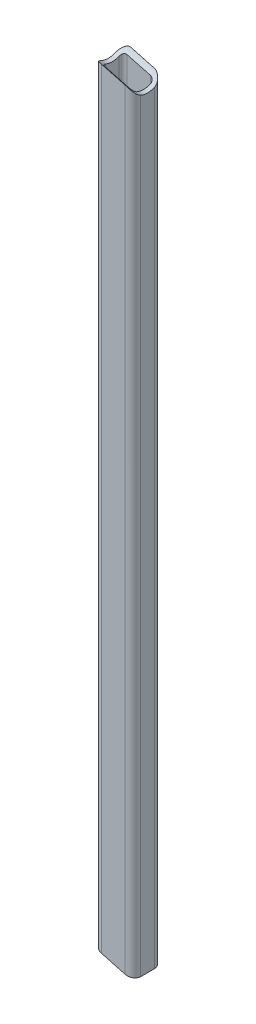
ISO-10303-21;
HEADER;
FILE_DESCRIPTION(('STEP AP214'),'2;1');
FILE_NAME('part.step','',(''),(''),'','','');
FILE_SCHEMA(('AUTOMOTIVE_DESIGN { 1 0 10303 214 1 1 1 1 }'));
ENDSEC;
DATA;
#1=APPLICATION_CONTEXT('core data for automotive mechanical design processes');
#2=APPLICATION_PROTOCOL_DEFINITION('international standard','automotive_design',2000,#1);
#3=PRODUCT_CONTEXT('',#1,'mechanical');
#4=PRODUCT('Part','Part','',(#3));
#5=PRODUCT_RELATED_PRODUCT_CATEGORY('part','',(#4));
#6=PRODUCT_DEFINITION_FORMATION('','',#4);
#7=PRODUCT_DEFINITION_CONTEXT('part definition',#1,'design');
#8=PRODUCT_DEFINITION('design','',#6,#7);
#9=PRODUCT_DEFINITION_SHAPE('','',#8);
#10=(LENGTH_UNIT() NAMED_UNIT(*) SI_UNIT(.MILLI.,.METRE.));
#11=(NAMED_UNIT(*) PLANE_ANGLE_UNIT() SI_UNIT($,.RADIAN.));
#12=(NAMED_UNIT(*) SI_UNIT($,.STERADIAN.) SOLID_ANGLE_UNIT());
#13=UNCERTAINTY_MEASURE_WITH_UNIT(LENGTH_MEASURE(1.E-05),#10,'distance_accuracy_value','');
#14=(GEOMETRIC_REPRESENTATION_CONTEXT(3) GLOBAL_UNCERTAINTY_ASSIGNED_CONTEXT((#13)) GLOBAL_UNIT_ASSIGNED_CONTEXT((#10,
#11,#12)) REPRESENTATION_CONTEXT('',''));
#15=CARTESIAN_POINT('',(0.,0.,0.));
#16=DIRECTION('',(0.,0.,1.));
#17=DIRECTION('',(1.,0.,0.));
#18=AXIS2_PLACEMENT_3D('',#15,#16,#17);
#19=CARTESIAN_POINT('',(-6.00000000000031,224.,-3.5));
#20=DIRECTION('',(0.,-0.999999999999998,0.));
#21=DIRECTION('',(0.,0.,-0.999999999999996));
#22=AXIS2_PLACEMENT_3D('',#19,#20,#21);
#23=CYLINDRICAL_SURFACE('',#22,4.);
#24=DIRECTION('',(0.,-0.999999999999998,0.));
#25=VECTOR('',#24,1.);
#26=CARTESIAN_POINT('',(-6.00000000000034,224.,-7.50000000000001));
#27=LINE('',#26,#25);
#28=CARTESIAN_POINT('',(-6.00000000000001,197.928203230275,-7.50000000000001));
#29=VERTEX_POINT('',#28);
#30=CARTESIAN_POINT('',(-6.00000000000017,-195.712812921102,-7.50000000000051));
#31=VERTEX_POINT('',#30);
#32=EDGE_CURVE('E324',#29,#31,#27,.T.);
#33=ORIENTED_EDGE('',*,*,#32,.T.);
#34=CARTESIAN_POINT('',(-5.99999999999973,-195.712812921102,-3.5000000000005));
#35=DIRECTION('',(0.258819045102521,0.965925826289067,0.));
#36=DIRECTION('',(0.965925826289067,-0.258819045102521,0.));
#37=AXIS2_PLACEMENT_3D('',#34,#35,#36);
#38=ELLIPSE('',#37,4.14110472164033,4.);
#39=CARTESIAN_POINT('',(-10.,-194.641016151378,-3.5000000000005));
#40=VERTEX_POINT('',#39);
#41=EDGE_CURVE('E502',#31,#40,#38,.T.);
#42=ORIENTED_EDGE('',*,*,#41,.T.);
#43=DIRECTION('',(0.,-0.999999999999998,0.));
#44=VECTOR('',#43,1.);
#45=CARTESIAN_POINT('',(-9.99999999999943,224.,-3.50000000000003));
#46=LINE('',#45,#44);
#47=CARTESIAN_POINT('',(-9.99999999999995,195.592324290019,-3.5));
#48=VERTEX_POINT('',#47);
#49=EDGE_CURVE('E321',#48,#40,#46,.T.);
#50=ORIENTED_EDGE('',*,*,#49,.F.);
#51=CARTESIAN_POINT('',(-5.99999999999928,197.954150165107,-7.50000000000001));
#52=CARTESIAN_POINT('',(-6.07199833976851,197.973492597121,-7.50002045898121));
#53=CARTESIAN_POINT('',(-6.14480047192218,197.989917015443,-7.49805654257957));
#54=CARTESIAN_POINT('',(-6.29125957351694,198.016687268511,-7.49005034652214));
#55=CARTESIAN_POINT('',(-6.3649161889391,198.027035534957,-7.48400970047258));
#56=CARTESIAN_POINT('',(-6.51138955973332,198.041329138648,-7.46785103020337));
#57=CARTESIAN_POINT('',(-6.58420414594102,198.04535947166,-7.45778945778067));
#58=CARTESIAN_POINT('',(-6.72922172049236,198.047421316556,-7.43365606834011));
#59=CARTESIAN_POINT('',(-6.8014247526313,198.045453261708,-7.41958454103117));
#60=CARTESIAN_POINT('',(-7.01593391728178,198.031051071808,-7.37159408672233));
#61=CARTESIAN_POINT('',(-7.15645001689288,198.010146292054,-7.3318647936688));
#62=CARTESIAN_POINT('',(-7.42911278218468,197.950371602743,-7.23879343922776));
#63=CARTESIAN_POINT('',(-7.56122804840271,197.911438338096,-7.18540367117243));
#64=CARTESIAN_POINT('',(-7.78111171289332,197.83295652889,-7.08303395896396));
#65=CARTESIAN_POINT('',(-7.87124843843999,197.796391540956,-7.03673200722882));
#66=CARTESIAN_POINT('',(-8.04606116759256,197.718019922535,-6.93855905867673));
#67=CARTESIAN_POINT('',(-8.1307346419815,197.67621089031,-6.88668551167908));
#68=CARTESIAN_POINT('',(-8.37684957860919,197.544868784455,-6.72326455201768));
#69=CARTESIAN_POINT('',(-8.53017078793913,197.449504017382,-6.60401912453665));
#70=CARTESIAN_POINT('',(-8.76821216131316,197.283925809094,-6.39023908556858));
#71=CARTESIAN_POINT('',(-8.85888648274131,197.215783156617,-6.30051501713396));
#72=CARTESIAN_POINT('',(-9.03069277241859,197.077540555344,-6.11361983488971));
#73=CARTESIAN_POINT('',(-9.11182182318818,197.007440016187,-6.01644645913547));
#74=CARTESIAN_POINT('',(-9.26434621631499,196.866554125815,-5.8151662255159));
#75=CARTESIAN_POINT('',(-9.33573867614176,196.795768578416,-5.71105732789957));
#76=CARTESIAN_POINT('',(-9.46846686126131,196.65451628929,-5.49641067634517));
#77=CARTESIAN_POINT('',(-9.5298029241981,196.584049536936,-5.38587313841788));
#78=CARTESIAN_POINT('',(-9.64236055092744,196.443791402045,-5.15814601859667));
#79=CARTESIAN_POINT('',(-9.69351187616677,196.374007666022,-5.04091696344782));
#80=CARTESIAN_POINT('',(-9.78461752030885,196.236345544497,-4.80119153894056));
#81=CARTESIAN_POINT('',(-9.82457789038078,196.16846614722,-4.67869805765408));
#82=CARTESIAN_POINT('',(-9.89265241982735,196.035340933163,-4.42946617292149));
#83=CARTESIAN_POINT('',(-9.92079431029,195.97008927987,-4.30273846832222));
#84=CARTESIAN_POINT('',(-9.96473371776024,195.842588017077,-4.04575986229331));
#85=CARTESIAN_POINT('',(-9.98054063520118,195.780336155463,-3.91551172225358));
#86=CARTESIAN_POINT('',(-9.99325304313632,195.698092228372,-3.73698561108989));
#87=CARTESIAN_POINT('',(-9.99577860897964,195.676616472675,-3.68974176439815));
#88=CARTESIAN_POINT('',(-9.99915120755163,195.634126947356,-3.5950339985138));
#89=CARTESIAN_POINT('',(-9.99999961947208,195.613112812203,-3.54757029234616));
#90=CARTESIAN_POINT('',(-9.99999999999995,195.592324290019,-3.5));
#91=B_SPLINE_CURVE_WITH_KNOTS('',3,(#51,#52,#53,#54,#55,#56,#57,#58,#59,#60,#61,#62,#63,#64,#65,
#66,#67,#68,#69,#70,#71,#72,#73,#74,#75,#76,#77,#78,#79,#80,#81,#82,#83,#84,#85,#86,#87,#88,#89,
#90),.UNSPECIFIED.,.F.,.F.,(4,2,2,2,2,2,2,2,2,2,2,2,2,2,2,2,2,2,2,4),(0.,0.223595701750445,
0.447101858533675,0.667574540309132,0.888031297538187,1.32802158562176,1.76956994559069,
2.09232548930576,2.41522939646784,3.06178470656212,3.49522503794044,3.928797506606,
4.36249805761301,4.79618404412007,5.23276454364592,5.66910851771006,6.10442284748007,
6.53940510107657,6.69525440572561,6.85097549576017),.UNSPECIFIED.);
#92=CARTESIAN_POINT('',(-6.36497043008316,198.025996762277,-7.48331477354791));
#93=VERTEX_POINT('',#92);
#94=EDGE_CURVE('E396',#93,#48,#91,.T.);
#95=ORIENTED_EDGE('',*,*,#94,.F.);
#96=CARTESIAN_POINT('',(-6.00000000000001,197.928203230275,-3.5));
#97=DIRECTION('',(0.258819045102521,0.965925826289067,0.));
#98=DIRECTION('',(0.965925826289067,-0.258819045102521,0.));
#99=AXIS2_PLACEMENT_3D('',#96,#97,#98);
#100=ELLIPSE('',#99,4.14110472164033,4.);
#101=EDGE_CURVE('E292',#29,#93,#100,.T.);
#102=ORIENTED_EDGE('',*,*,#101,.F.);
#103=EDGE_LOOP('',(#33,#42,#50,#95,#102));
#104=FACE_BOUND('',#103,.T.);
#105=ADVANCED_FACE('F136',(#104),#23,.T.);
#106=CARTESIAN_POINT('',(6.00000000000039,224.,-3.5));
#107=DIRECTION('',(0.,-0.999999999999998,0.));
#108=DIRECTION('',(0.,0.,-0.999999999999996));
#109=AXIS2_PLACEMENT_3D('',#106,#107,#108);
#110=CYLINDRICAL_SURFACE('',#109,4.);
#111=DIRECTION('',(0.,-0.999999999999998,0.));
#112=VECTOR('',#111,1.);
#113=CARTESIAN_POINT('',(10.,224.,-3.4999999999995));
#114=LINE('',#113,#112);
#115=CARTESIAN_POINT('',(10.,190.233340441396,-3.5));
#116=VERTEX_POINT('',#115);
#117=CARTESIAN_POINT('',(10.0000000000006,-200.000000000001,-3.5));
#118=VERTEX_POINT('',#117);
#119=EDGE_CURVE('E277',#116,#118,#114,.T.);
#120=ORIENTED_EDGE('',*,*,#119,.T.);
#121=CARTESIAN_POINT('',(5.99999999999989,-198.928203230275,-3.5));
#122=DIRECTION('',(0.258819045102521,0.965925826289067,0.));
#123=DIRECTION('',(0.965925826289067,-0.258819045102521,0.));
#124=AXIS2_PLACEMENT_3D('',#121,#122,#123);
#125=ELLIPSE('',#124,4.14110472164033,4.);
#126=CARTESIAN_POINT('',(5.99999999999989,-198.928203230275,-7.49999999999998));
#127=VERTEX_POINT('',#126);
#128=EDGE_CURVE('E286',#118,#127,#125,.T.);
#129=ORIENTED_EDGE('',*,*,#128,.T.);
#130=DIRECTION('',(0.,-0.999999999999998,0.));
#131=VECTOR('',#130,1.);
#132=CARTESIAN_POINT('',(6.00000000000039,224.,-7.50000000000001));
#133=LINE('',#132,#131);
#134=CARTESIAN_POINT('',(6.00000000000009,194.712812921102,-7.50000000000001));
#135=VERTEX_POINT('',#134);
#136=EDGE_CURVE('E327',#135,#127,#133,.T.);
#137=ORIENTED_EDGE('',*,*,#136,.F.);
#138=CARTESIAN_POINT('',(6.00000000000009,194.712812921102,-3.5));
#139=DIRECTION('',(0.258819045102521,0.965925826289067,0.));
#140=DIRECTION('',(0.965925826289067,-0.258819045102521,0.));
#141=AXIS2_PLACEMENT_3D('',#138,#139,#140);
#142=ELLIPSE('',#141,4.14110472164033,4.);
#143=CARTESIAN_POINT('',(6.36497043008322,194.6150193891,-7.48331477354788));
#144=VERTEX_POINT('',#143);
#145=EDGE_CURVE('E339',#144,#135,#142,.T.);
#146=ORIENTED_EDGE('',*,*,#145,.F.);
#147=CARTESIAN_POINT('',(10.,190.233340441396,-3.5));
#148=CARTESIAN_POINT('',(10.0000039597587,190.285497682975,-3.61941159564714));
#149=CARTESIAN_POINT('',(9.99465514727837,190.341497889154,-3.73702282390056));
#150=CARTESIAN_POINT('',(9.9742431187977,190.460102707452,-3.9677186439569));
#151=CARTESIAN_POINT('',(9.95919911188195,190.52269405584,-4.08081171805826));
#152=CARTESIAN_POINT('',(9.92057780956657,190.652946705788,-4.30089619738556));
#153=CARTESIAN_POINT('',(9.89708897308762,190.720549886486,-4.40793801081459));
#154=CARTESIAN_POINT('',(9.84242896111663,190.86053929694,-4.61687362274736));
#155=CARTESIAN_POINT('',(9.81125298798812,190.932928492979,-4.71876415823619));
#156=CARTESIAN_POINT('',(9.73151586870854,191.104218626421,-4.94725457474902));
#157=CARTESIAN_POINT('',(9.68054954960423,191.204503204068,-5.07197958564878));
#158=CARTESIAN_POINT('',(9.56839567317739,191.410213644478,-5.31221797948048));
#159=CARTESIAN_POINT('',(9.50720614765537,191.515640494472,-5.42772958228323));
#160=CARTESIAN_POINT('',(9.37539741752909,191.730811161628,-5.65023174495112));
#161=CARTESIAN_POINT('',(9.30473228545341,191.840574042118,-5.75717647271143));
#162=CARTESIAN_POINT('',(9.15502253840616,192.062669033592,-5.96209970225179));
#163=CARTESIAN_POINT('',(9.07597858730317,192.175000940475,-6.0600789132411));
#164=CARTESIAN_POINT('',(8.9076649640863,192.404249240453,-6.24991376444276));
#165=CARTESIAN_POINT('',(8.81817116116514,192.52120599516,-6.34152156690262));
#166=CARTESIAN_POINT('',(8.63099324787651,192.755363054529,-6.51566267516224));
#167=CARTESIAN_POINT('',(8.53330753111056,192.872563402543,-6.59819419377387));
#168=CARTESIAN_POINT('',(8.32964381500081,193.105678533644,-6.75410493389803));
#169=CARTESIAN_POINT('',(8.22367208920214,193.221594214898,-6.82749097255141));
#170=CARTESIAN_POINT('',(8.00286890281658,193.450378162225,-6.96488352133596));
#171=CARTESIAN_POINT('',(7.88804171603827,193.563247863277,-7.02889451332545));
#172=CARTESIAN_POINT('',(7.62563196365069,193.804690330092,-7.15823004014473));
#173=CARTESIAN_POINT('',(7.47597109743582,193.932172182084,-7.22149343606077));
#174=CARTESIAN_POINT('',(7.23972582691607,194.112729301501,-7.3039384648415));
#175=CARTESIAN_POINT('',(7.15924538972838,194.170998017666,-7.3292946404341));
#176=CARTESIAN_POINT('',(6.99397576033971,194.283020472454,-7.37548560794321));
#177=CARTESIAN_POINT('',(6.90918728749537,194.336774960913,-7.39632115167346));
#178=CARTESIAN_POINT('',(6.69513395819922,194.461758847237,-7.44126739000091));
#179=CARTESIAN_POINT('',(6.56325986304434,194.529739578734,-7.46251929741795));
#180=CARTESIAN_POINT('',(6.35792801859199,194.618812891832,-7.48455682130846));
#181=CARTESIAN_POINT('',(6.28781334136135,194.646473190418,-7.49026641545984));
#182=CARTESIAN_POINT('',(6.14542576467514,194.69666142003,-7.49799396717611));
#183=CARTESIAN_POINT('',(6.07314887646443,194.719179107415,-7.50000461196689));
#184=CARTESIAN_POINT('',(6.00000000000048,194.738759855933,-7.50000000000001));
#185=B_SPLINE_CURVE_WITH_KNOTS('',3,(#147,#148,#149,#150,#151,#152,#153,#154,#155,#156,#157,
#158,#159,#160,#161,#162,#163,#164,#165,#166,#167,#168,#169,#170,#171,#172,#173,#174,#175,#176,
#177,#178,#179,#180,#181,#182,#183,#184),.UNSPECIFIED.,.F.,.F.,(4,2,2,2,2,2,2,2,2,2,2,2,2,2,2,2,
2,2,4),(0.,0.390576619612435,0.780381759175893,1.16621731551446,1.55229428879928,
2.05542899139974,2.5586606707165,3.06442613676449,3.57015156003498,4.09001821372232,
4.60998705044375,5.12956594843268,5.64889563872234,6.26689605724757,6.57428345010519,
6.88161968296681,7.32948745767249,7.55599195818499,7.78294377586684),.UNSPECIFIED.);
#186=EDGE_CURVE('E347',#116,#144,#185,.T.);
#187=ORIENTED_EDGE('',*,*,#186,.F.);
#188=EDGE_LOOP('',(#120,#129,#137,#146,#187));
#189=FACE_BOUND('',#188,.T.);
#190=ADVANCED_FACE('F346',(#189),#110,.T.);
#191=CARTESIAN_POINT('',(6.00000000000042,224.,3.5));
#192=DIRECTION('',(0.,-0.999999999999998,0.));
#193=DIRECTION('',(0.,0.,-0.999999999999996));
#194=AXIS2_PLACEMENT_3D('',#191,#192,#193);
#195=CYLINDRICAL_SURFACE('',#194,4.);
#196=DIRECTION('',(0.,-0.999999999999998,0.));
#197=VECTOR('',#196,1.);
#198=CARTESIAN_POINT('',(6.00000000000045,224.,7.49999999999998));
#199=LINE('',#198,#197);
#200=CARTESIAN_POINT('',(6.00000000000012,194.712812921102,7.50000000000001));
#201=VERTEX_POINT('',#200);
#202=CARTESIAN_POINT('',(5.99999999999989,-198.928203230275,7.50000000000001));
#203=VERTEX_POINT('',#202);
#204=EDGE_CURVE('E276',#201,#203,#199,.T.);
#205=ORIENTED_EDGE('',*,*,#204,.T.);
#206=CARTESIAN_POINT('',(5.99999999999989,-198.928203230275,3.5));
#207=DIRECTION('',(0.258819045102521,0.965925826289067,0.));
#208=DIRECTION('',(0.965925826289067,-0.258819045102521,0.));
#209=AXIS2_PLACEMENT_3D('',#206,#207,#208);
#210=ELLIPSE('',#209,4.14110472164033,4.);
#211=CARTESIAN_POINT('',(10.0000000000002,-200.,3.5));
#212=VERTEX_POINT('',#211);
#213=EDGE_CURVE('E281',#203,#212,#210,.T.);
#214=ORIENTED_EDGE('',*,*,#213,.T.);
#215=DIRECTION('',(0.,-0.999999999999998,0.));
#216=VECTOR('',#215,1.);
#217=CARTESIAN_POINT('',(10.0000000000001,224.,3.5000000000005));
#218=LINE('',#217,#216);
#219=CARTESIAN_POINT('',(10.0000000000002,190.233340441397,3.5));
#220=VERTEX_POINT('',#219);
#221=EDGE_CURVE('E266',#220,#212,#218,.T.);
#222=ORIENTED_EDGE('',*,*,#221,.F.);
#223=CARTESIAN_POINT('',(6.00000000000073,194.738759855933,7.50000000000001));
#224=CARTESIAN_POINT('',(6.08297214714933,194.716558452236,7.50000710865694));
#225=CARTESIAN_POINT('',(6.16479948079753,194.690573445014,7.49741964667582));
#226=CARTESIAN_POINT('',(6.32556770304144,194.632113238928,7.48753747152493));
#227=CARTESIAN_POINT('',(6.4045159515217,194.599656196241,7.480255802324));
#228=CARTESIAN_POINT('',(6.63454569787186,194.495003998734,7.45234227799835));
#229=CARTESIAN_POINT('',(6.78127408649056,194.414813163013,7.4256124494345));
#230=CARTESIAN_POINT('',(7.03007803752751,194.260318902147,7.36669701618611));
#231=CARTESIAN_POINT('',(7.1346771095572,194.188882661342,7.33716832504121));
#232=CARTESIAN_POINT('',(7.33726608227173,194.039937377998,7.27134643532528));
#233=CARTESIAN_POINT('',(7.4352533628667,193.962425954011,7.2350505762846));
#234=CARTESIAN_POINT('',(7.62599854026475,193.802479494651,7.15607503013969));
#235=CARTESIAN_POINT('',(7.71870135416903,193.720006384109,7.1133407617991));
#236=CARTESIAN_POINT('',(7.89850709904157,193.552127085546,7.02219026303801));
#237=CARTESIAN_POINT('',(7.98560836316367,193.466720035969,6.973772353342));
#238=CARTESIAN_POINT('',(8.20072514445723,193.246959010643,6.84367108346048));
#239=CARTESIAN_POINT('',(8.32516112415453,193.111302343458,6.75824174886045));
#240=CARTESIAN_POINT('',(8.5626861555181,192.83838964291,6.57492088784188));
#241=CARTESIAN_POINT('',(8.67576896978568,192.701132776117,6.47702257727831));
#242=CARTESIAN_POINT('',(8.89050855051055,192.427606539852,6.26898079011316));
#243=CARTESIAN_POINT('',(8.99218990994102,192.291335662103,6.1588647301714));
#244=CARTESIAN_POINT('',(9.18392222010827,192.021546833754,5.92597931508062));
#245=CARTESIAN_POINT('',(9.27397940439014,191.888027440205,5.80321680572463));
#246=CARTESIAN_POINT('',(9.41714000543874,191.663743841642,5.58209130094009));
#247=CARTESIAN_POINT('',(9.47339094459874,191.57179884798,5.48696224253226));
#248=CARTESIAN_POINT('',(9.57887562655249,191.391114080107,5.290012236524));
#249=CARTESIAN_POINT('',(9.628107878295,191.30237498994,5.1881898736896));
#250=CARTESIAN_POINT('',(9.76375821122448,191.043003151825,4.87337554123131));
#251=CARTESIAN_POINT('',(9.83875321160795,190.878244784008,4.65009854418406));
#252=CARTESIAN_POINT('',(9.92779285296291,190.633365537877,4.27079135487001));
#253=CARTESIAN_POINT('',(9.9542055181791,190.545374255137,4.12268598476501));
#254=CARTESIAN_POINT('',(9.9812907759854,190.421743949823,3.89402688730338));
#255=CARTESIAN_POINT('',(9.98823185997928,190.381831170399,3.81650757520415));
#256=CARTESIAN_POINT('',(9.99758874900283,190.305147451478,3.65959032348482));
#257=CARTESIAN_POINT('',(10.0000009657707,190.268379025275,3.58019094466057));
#258=CARTESIAN_POINT('',(10.0000000000002,190.233340441397,3.49999999999998));
#259=B_SPLINE_CURVE_WITH_KNOTS('',3,(#223,#224,#225,#226,#227,#228,#229,#230,#231,#232,#233,
#234,#235,#236,#237,#238,#239,#240,#241,#242,#243,#244,#245,#246,#247,#248,#249,#250,#251,#252,
#253,#254,#255,#256,#257,#258),.UNSPECIFIED.,.F.,.F.,(4,2,2,2,2,2,2,2,2,2,2,2,2,2,2,2,2,4),(0.,
0.257343886331635,0.513975746035608,1.01966699430199,1.40938925022098,1.79926504732163,
2.19265426816888,2.58616001282298,3.19417410424902,3.80252042974419,4.40952822694788,
5.01620914751301,5.44714111266681,5.87816448910077,6.73579033771166,7.25741840694417,
7.51963881321162,7.78206689150552),.UNSPECIFIED.);
#260=CARTESIAN_POINT('',(6.36497043008333,194.6150193891,7.48331477354788));
#261=VERTEX_POINT('',#260);
#262=EDGE_CURVE('E413',#261,#220,#259,.T.);
#263=ORIENTED_EDGE('',*,*,#262,.F.);
#264=CARTESIAN_POINT('',(6.00000000000012,194.712812921102,3.5));
#265=DIRECTION('',(0.258819045102521,0.965925826289067,0.));
#266=DIRECTION('',(0.965925826289067,-0.258819045102521,0.));
#267=AXIS2_PLACEMENT_3D('',#264,#265,#266);
#268=ELLIPSE('',#267,4.14110472164033,4.);
#269=EDGE_CURVE('E348',#201,#261,#268,.T.);
#270=ORIENTED_EDGE('',*,*,#269,.F.);
#271=EDGE_LOOP('',(#205,#214,#222,#263,#270));
#272=FACE_BOUND('',#271,.T.);
#273=ADVANCED_FACE('F282',(#272),#195,.T.);
#274=CARTESIAN_POINT('',(-5.99999999999951,224.000000000001,3.49999999999998));
#275=DIRECTION('',(0.,-0.999999999999998,0.));
#276=DIRECTION('',(0.,0.,-0.999999999999996));
#277=AXIS2_PLACEMENT_3D('',#274,#275,#276);
#278=CYLINDRICAL_SURFACE('',#277,4.);
#279=DIRECTION('',(0.,-0.999999999999998,0.));
#280=VECTOR('',#279,1.);
#281=CARTESIAN_POINT('',(-9.99999999999937,224.,3.49999999999998));
#282=LINE('',#281,#280);
#283=CARTESIAN_POINT('',(-9.99999999999993,195.592324290019,3.49999999999998));
#284=VERTEX_POINT('',#283);
#285=CARTESIAN_POINT('',(-10.,-194.641016151378,3.4999999999995));
#286=VERTEX_POINT('',#285);
#287=EDGE_CURVE('E318',#284,#286,#282,.T.);
#288=ORIENTED_EDGE('',*,*,#287,.T.);
#289=CARTESIAN_POINT('',(-5.99999999999973,-195.712812921102,3.4999999999995));
#290=DIRECTION('',(0.258819045102521,0.965925826289067,0.));
#291=DIRECTION('',(0.965925826289067,-0.258819045102521,0.));
#292=AXIS2_PLACEMENT_3D('',#289,#290,#291);
#293=ELLIPSE('',#292,4.14110472164033,4.);
#294=CARTESIAN_POINT('',(-6.00000000000017,-195.712812921102,7.49999999999951));
#295=VERTEX_POINT('',#294);
#296=EDGE_CURVE('E495',#286,#295,#293,.T.);
#297=ORIENTED_EDGE('',*,*,#296,.T.);
#298=DIRECTION('',(0.,-0.999999999999998,0.));
#299=VECTOR('',#298,1.);
#300=CARTESIAN_POINT('',(-5.99999999999998,224.,7.49999999999998));
#301=LINE('',#300,#299);
#302=CARTESIAN_POINT('',(-5.99999999999995,197.928203230275,7.49999999999998));
#303=VERTEX_POINT('',#302);
#304=EDGE_CURVE('E332',#303,#295,#301,.T.);
#305=ORIENTED_EDGE('',*,*,#304,.F.);
#306=CARTESIAN_POINT('',(-5.99999999999995,197.928203230275,3.5));
#307=DIRECTION('',(0.258819045102521,0.965925826289067,0.));
#308=DIRECTION('',(0.965925826289067,-0.258819045102521,0.));
#309=AXIS2_PLACEMENT_3D('',#306,#307,#308);
#310=ELLIPSE('',#309,4.14110472164033,4.);
#311=CARTESIAN_POINT('',(-6.36497043008311,198.025996762277,7.48331477354791));
#312=VERTEX_POINT('',#311);
#313=EDGE_CURVE('E356',#312,#303,#310,.T.);
#314=ORIENTED_EDGE('',*,*,#313,.F.);
#315=CARTESIAN_POINT('',(-9.99999999999993,195.592324290019,3.49999999999998));
#316=CARTESIAN_POINT('',(-10.000011196747,195.647401198976,3.62609638231995));
#317=CARTESIAN_POINT('',(-9.99403895210997,195.704114545441,3.75143983148846));
#318=CARTESIAN_POINT('',(-9.97062902587805,195.820439077019,3.99960214930839));
#319=CARTESIAN_POINT('',(-9.95319814762585,195.880048523192,4.12242247142273));
#320=CARTESIAN_POINT('',(-9.9074491292813,196.001649330052,4.36425990547077));
#321=CARTESIAN_POINT('',(-9.87916820119865,196.063631904711,4.4832885268491));
#322=CARTESIAN_POINT('',(-9.81223486018251,196.189735256112,4.71723844432132));
#323=CARTESIAN_POINT('',(-9.77358107840729,196.253856314077,4.83215919605512));
#324=CARTESIAN_POINT('',(-9.68650736806057,196.383563114369,5.05697223727112));
#325=CARTESIAN_POINT('',(-9.63811056917698,196.449145066654,5.16687569354738));
#326=CARTESIAN_POINT('',(-9.53194005532002,196.581327731769,5.38141601417797));
#327=CARTESIAN_POINT('',(-9.4741659618002,196.647928485628,5.48605266569628));
#328=CARTESIAN_POINT('',(-9.34951826788167,196.781551656527,5.68975067868591));
#329=CARTESIAN_POINT('',(-9.2826312685636,196.848574553208,5.78880352116621));
#330=CARTESIAN_POINT('',(-9.14009445070405,196.982110160462,5.98074512999958));
#331=CARTESIAN_POINT('',(-9.06444559260491,197.048622926105,6.07363457020945));
#332=CARTESIAN_POINT('',(-8.91362913718892,197.172635610362,6.24264319224808));
#333=CARTESIAN_POINT('',(-8.83938626135027,197.2302998935,6.31946792181388));
#334=CARTESIAN_POINT('',(-8.68412890760772,197.343549870623,6.46765400354763));
#335=CARTESIAN_POINT('',(-8.60311369864936,197.399135339265,6.53901476429827));
#336=CARTESIAN_POINT('',(-8.43438265649652,197.507019026755,6.67577650330552));
#337=CARTESIAN_POINT('',(-8.34667720109703,197.559322116341,6.74118638024564));
#338=CARTESIAN_POINT('',(-8.16441260416273,197.659254845873,6.86563348820297));
#339=CARTESIAN_POINT('',(-8.06985694280674,197.706886830376,6.92467391772758));
#340=CARTESIAN_POINT('',(-7.84611105936458,197.808191216622,7.0514428128464));
#341=CARTESIAN_POINT('',(-7.71466740262581,197.859785744575,7.11693399051133));
#342=CARTESIAN_POINT('',(-7.44096732063083,197.947072810348,7.23439037261954));
#343=CARTESIAN_POINT('',(-7.29873396895223,197.982798220893,7.28638344447809));
#344=CARTESIAN_POINT('',(-7.02987238963871,198.028293013712,7.36725814332138));
#345=CARTESIAN_POINT('',(-6.90454530000155,198.041374179084,7.39853834560732));
#346=CARTESIAN_POINT('',(-6.65085806707449,198.049309657256,7.44880009067561));
#347=CARTESIAN_POINT('',(-6.52250158011665,198.044184927744,7.46779574502835));
#348=CARTESIAN_POINT('',(-6.32831154070029,198.021980084532,7.48706729147808));
#349=CARTESIAN_POINT('',(-6.26204436035365,198.011820417643,7.49195210286398));
#350=CARTESIAN_POINT('',(-6.13031408616948,197.986602008509,7.49842053229439));
#351=CARTESIAN_POINT('',(-6.064850640277,197.971545496883,7.50000565099181));
#352=CARTESIAN_POINT('',(-5.99999999999926,197.954150165107,7.49999999999998));
#353=B_SPLINE_CURVE_WITH_KNOTS('',3,(#315,#316,#317,#318,#319,#320,#321,#322,#323,#324,#325,
#326,#327,#328,#329,#330,#331,#332,#333,#334,#335,#336,#337,#338,#339,#340,#341,#342,#343,#344,
#345,#346,#347,#348,#349,#350,#351,#352),.UNSPECIFIED.,.F.,.F.,(4,2,2,2,2,2,2,2,2,2,2,2,2,2,2,2,
2,2,4),(0.,0.412608288265835,0.824971819311023,1.23593354595824,1.64694953138968,
2.05700104325547,2.46706911236749,2.87774675523245,3.28837942367237,3.6522869291968,
4.01623376837289,4.37962711137785,4.7428371134715,5.20835688321471,5.67290778413489,
6.06075324602136,6.44815238490859,6.64957411762557,6.85090422659688),.UNSPECIFIED.);
#354=EDGE_CURVE('E405',#284,#312,#353,.T.);
#355=ORIENTED_EDGE('',*,*,#354,.F.);
#356=EDGE_LOOP('',(#288,#297,#305,#314,#355));
#357=FACE_BOUND('',#356,.T.);
#358=ADVANCED_FACE('F138',(#357),#278,.T.);
#359=CARTESIAN_POINT('',(-6.00000000000031,224.,-3.5));
#360=DIRECTION('',(0.,-0.999999999999998,0.));
#361=DIRECTION('',(0.,0.,-0.999999999999996));
#362=AXIS2_PLACEMENT_3D('',#359,#360,#361);
#363=CYLINDRICAL_SURFACE('',#362,2.);
#364=CARTESIAN_POINT('',(-5.99999999999973,-195.712812921102,-3.5000000000005));
#365=DIRECTION('',(0.258819045102521,0.965925826289067,0.));
#366=DIRECTION('',(0.965925826289067,-0.258819045102521,0.));
#367=AXIS2_PLACEMENT_3D('',#364,#365,#366);
#368=ELLIPSE('',#367,2.07055236082017,2.);
#369=CARTESIAN_POINT('',(-6.00000000000017,-195.712812921102,-5.5000000000005));
#370=VERTEX_POINT('',#369);
#371=CARTESIAN_POINT('',(-8.00000000000001,-195.17691453624,-3.5000000000005));
#372=VERTEX_POINT('',#371);
#373=EDGE_CURVE('E152',#370,#372,#368,.T.);
#374=ORIENTED_EDGE('',*,*,#373,.F.);
#375=DIRECTION('',(0.,-0.999999999999998,0.));
#376=VECTOR('',#375,1.);
#377=CARTESIAN_POINT('',(-6.00000000000031,224.,-5.50000000000001));
#378=LINE('',#377,#376);
#379=CARTESIAN_POINT('',(-5.99999999999962,195.729376605515,-5.50000000000001));
#380=VERTEX_POINT('',#379);
#381=EDGE_CURVE('E303',#380,#370,#378,.T.);
#382=ORIENTED_EDGE('',*,*,#381,.F.);
#383=CARTESIAN_POINT('',(-5.99999999999962,195.729376605515,-5.50000000000001));
#384=CARTESIAN_POINT('',(-6.04387885250471,195.741142631754,-5.50000668106419));
#385=CARTESIAN_POINT('',(-6.08805842744288,195.751817723569,-5.4985559377919));
#386=CARTESIAN_POINT('',(-6.17672294076924,195.770875571795,-5.49267079400469));
#387=CARTESIAN_POINT('',(-6.2212079553548,195.77925773319,-5.48823562006119));
#388=CARTESIAN_POINT('',(-6.31004123639406,195.793593193347,-5.47632921250855));
#389=CARTESIAN_POINT('',(-6.35438954091342,195.79955314263,-5.46886640597068));
#390=CARTESIAN_POINT('',(-6.44271300428273,195.80903126179,-5.45090750731976));
#391=CARTESIAN_POINT('',(-6.48668821452412,195.812549773537,-5.44041184018352));
#392=CARTESIAN_POINT('',(-6.61772156133485,195.819438616841,-5.40436491692737));
#393=CARTESIAN_POINT('',(-6.70379527353737,195.819127515637,-5.37426594833111));
#394=CARTESIAN_POINT('',(-6.87052420597753,195.809364869131,-5.30289575279125));
#395=CARTESIAN_POINT('',(-6.95117945285738,195.799913368775,-5.26162458078561));
#396=CARTESIAN_POINT('',(-7.10527519555256,195.773213767687,-5.16926368360949));
#397=CARTESIAN_POINT('',(-7.17871094637671,195.755960580478,-5.11816756536712));
#398=CARTESIAN_POINT('',(-7.31710880343283,195.715209531145,-5.007673728483));
#399=CARTESIAN_POINT('',(-7.38206549386634,195.69170770667,-4.94827075371429));
#400=CARTESIAN_POINT('',(-7.51104481889191,195.636413335829,-4.81398461523992));
#401=CARTESIAN_POINT('',(-7.57371998791852,195.603926033922,-4.73809561403374));
#402=CARTESIAN_POINT('',(-7.68659973564091,195.534709545489,-4.57929846447495));
#403=CARTESIAN_POINT('',(-7.7367958561392,195.497977506483,-4.49638560616827));
#404=CARTESIAN_POINT('',(-7.83132022119591,195.415743926536,-4.31159142333223));
#405=CARTESIAN_POINT('',(-7.87344680659501,195.369776611966,-4.20879011702201));
#406=CARTESIAN_POINT('',(-7.94002481664659,195.276058930998,-3.99845227958404));
#407=CARTESIAN_POINT('',(-7.96448691878834,195.228309660112,-3.89091865073975));
#408=CARTESIAN_POINT('',(-7.98665063069169,195.159723317,-3.73549795310531));
#409=CARTESIAN_POINT('',(-7.99165900657802,195.139034573269,-3.68849180182166));
#410=CARTESIAN_POINT('',(-7.99832958513916,195.09769528379,-3.5943351068873));
#411=CARTESIAN_POINT('',(-7.99999825942398,195.077044741788,-3.54718502016047));
#412=CARTESIAN_POINT('',(-8.0000000000004,195.056425905157,-3.5));
#413=B_SPLINE_CURVE_WITH_KNOTS('',3,(#383,#384,#385,#386,#387,#388,#389,#390,#391,#392,#393,
#394,#395,#396,#397,#398,#399,#400,#401,#402,#403,#404,#405,#406,#407,#408,#409,#410,#411,#412),
.UNSPECIFIED.,.F.,.F.,(4,2,2,2,2,2,2,2,2,2,2,2,2,2,4),(0.,0.136260837000562,0.272557000213957,
0.408476373188194,0.544376709812684,0.816455910223627,1.08853377274263,1.36078927856366,
1.63321783897282,1.94297387906487,2.25293930035905,2.61218437826853,2.97121212439408,
3.12592667168909,3.28034112468622),.UNSPECIFIED.);
#414=CARTESIAN_POINT('',(-8.0000000000004,195.056425905157,-3.5));
#415=VERTEX_POINT('',#414);
#416=EDGE_CURVE('E361',#380,#415,#413,.T.);
#417=ORIENTED_EDGE('',*,*,#416,.T.);
#418=DIRECTION('',(0.,-0.999999999999998,0.));
#419=VECTOR('',#418,1.);
#420=CARTESIAN_POINT('',(-7.99999999999951,224.000000000001,-3.5));
#421=LINE('',#420,#419);
#422=EDGE_CURVE('E295',#415,#372,#421,.T.);
#423=ORIENTED_EDGE('',*,*,#422,.T.);
#424=EDGE_LOOP('',(#374,#382,#417,#423));
#425=FACE_BOUND('',#424,.T.);
#426=ADVANCED_FACE('F372',(#425),#363,.F.);
#427=CARTESIAN_POINT('',(-6.00000000000031,224.,-5.50000000000001));
#428=DIRECTION('',(0.,0.,0.999999999999996));
#429=DIRECTION('',(0.999999999999998,0.,0.));
#430=AXIS2_PLACEMENT_3D('',#427,#428,#429);
#431=PLANE('',#430);
#432=DIRECTION('',(-0.965925826289067,0.258819045102521,0.));
#433=VECTOR('',#432,1.);
#434=CARTESIAN_POINT('',(-110.928203230276,-167.597385602301,-5.5000000000015));
#435=LINE('',#434,#433);
#436=CARTESIAN_POINT('',(5.99999999999989,-198.928203230275,-5.49999999999998));
#437=VERTEX_POINT('',#436);
#438=EDGE_CURVE('E159',#437,#370,#435,.T.);
#439=ORIENTED_EDGE('',*,*,#438,.F.);
#440=DIRECTION('',(0.,-0.999999999999998,0.));
#441=VECTOR('',#440,1.);
#442=CARTESIAN_POINT('',(6.00000000000039,224.,-5.50000000000001));
#443=LINE('',#442,#441);
#444=CARTESIAN_POINT('',(6.00000000000009,192.513986296342,-5.50000000000001));
#445=VERTEX_POINT('',#444);
#446=EDGE_CURVE('E305',#445,#437,#443,.T.);
#447=ORIENTED_EDGE('',*,*,#446,.F.);
#448=DIRECTION('',(0.965925826289067,-0.258819045102521,0.));
#449=VECTOR('',#448,1.);
#450=CARTESIAN_POINT('',(-20.2089649190804,199.536657280865,-5.5000000000005));
#451=LINE('',#450,#449);
#452=EDGE_CURVE('E370',#445,#380,#451,.F.);
#453=ORIENTED_EDGE('',*,*,#452,.T.);
#454=ORIENTED_EDGE('',*,*,#381,.T.);
#455=EDGE_LOOP('',(#439,#447,#453,#454));
#456=FACE_BOUND('',#455,.T.);
#457=ADVANCED_FACE('F449',(#456),#431,.T.);
#458=CARTESIAN_POINT('',(6.00000000000039,224.,-3.5));
#459=DIRECTION('',(0.,-0.999999999999998,0.));
#460=DIRECTION('',(0.,0.,-0.999999999999996));
#461=AXIS2_PLACEMENT_3D('',#458,#459,#460);
#462=CYLINDRICAL_SURFACE('',#461,2.);
#463=CARTESIAN_POINT('',(5.99999999999989,-198.928203230275,-3.5));
#464=DIRECTION('',(0.258819045102521,0.965925826289067,0.));
#465=DIRECTION('',(0.965925826289067,-0.258819045102521,0.));
#466=AXIS2_PLACEMENT_3D('',#463,#464,#465);
#467=ELLIPSE('',#466,2.07055236082017,2.);
#468=CARTESIAN_POINT('',(7.9999999999999,-199.464101615138,-3.5));
#469=VERTEX_POINT('',#468);
#470=EDGE_CURVE('E512',#469,#437,#467,.T.);
#471=ORIENTED_EDGE('',*,*,#470,.F.);
#472=DIRECTION('',(0.,-0.999999999999998,0.));
#473=VECTOR('',#472,1.);
#474=CARTESIAN_POINT('',(7.99999999999998,224.,-3.4999999999995));
#475=LINE('',#474,#473);
#476=CARTESIAN_POINT('',(7.99999999999994,190.769238826259,-3.5));
#477=VERTEX_POINT('',#476);
#478=EDGE_CURVE('E307',#477,#469,#475,.T.);
#479=ORIENTED_EDGE('',*,*,#478,.F.);
#480=CARTESIAN_POINT('',(7.99999999999994,190.769238826259,-3.5));
#481=CARTESIAN_POINT('',(7.99999736480943,190.796607081065,-3.56263686182612));
#482=CARTESIAN_POINT('',(7.99705782504283,190.825346887786,-3.62460553821747));
#483=CARTESIAN_POINT('',(7.98566283588837,190.885185912272,-3.74679200708064));
#484=CARTESIAN_POINT('',(7.97721367425486,190.916282404804,-3.80701171380065));
#485=CARTESIAN_POINT('',(7.94427851350685,191.012189467307,-3.983824445972));
#486=CARTESIAN_POINT('',(7.91219458422573,191.080003605043,-4.09744123289755));
#487=CARTESIAN_POINT('',(7.83050809294005,191.220398504088,-4.3140036591865));
#488=CARTESIAN_POINT('',(7.78098365047661,191.292956853876,-4.41699427814447));
#489=CARTESIAN_POINT('',(7.66618221756798,191.440808599984,-4.61205661735975));
#490=CARTESIAN_POINT('',(7.60086509786561,191.516108541914,-4.70409961625653));
#491=CARTESIAN_POINT('',(7.4441203282832,191.678980544954,-4.88981607501958));
#492=CARTESIAN_POINT('',(7.35018111954323,191.766574560196,-4.98136150004607));
#493=CARTESIAN_POINT('',(7.14397120218011,191.937693359773,-5.14581042207696));
#494=CARTESIAN_POINT('',(7.03171433594826,192.021221155483,-5.21872789002908));
#495=CARTESIAN_POINT('',(6.82230786128831,192.157673303242,-5.32583638013191));
#496=CARTESIAN_POINT('',(6.72920675501266,192.212789199771,-5.36516854981255));
#497=CARTESIAN_POINT('',(6.5345134082838,192.315228641559,-5.42996145055698));
#498=CARTESIAN_POINT('',(6.43295312511822,192.362579672341,-5.45547187983718));
#499=CARTESIAN_POINT('',(6.27489076564438,192.425772649734,-5.48175025976324));
#500=CARTESIAN_POINT('',(6.22093547668478,192.44561887435,-5.48851535121901));
#501=CARTESIAN_POINT('',(6.111500072782,192.482228407284,-5.49764654125296));
#502=CARTESIAN_POINT('',(6.0560169100514,192.498984949439,-5.50000308622346));
#503=CARTESIAN_POINT('',(6.00000000000009,192.513986296342,-5.50000000000001));
#504=B_SPLINE_CURVE_WITH_KNOTS('',3,(#480,#481,#482,#483,#484,#485,#486,#487,#488,#489,#490,
#491,#492,#493,#494,#495,#496,#497,#498,#499,#500,#501,#502,#503),.UNSPECIFIED.,.F.,.F.,(4,2,2,
2,2,2,2,2,2,2,2,4),(0.,0.204878854571511,0.409524303166124,0.815999272901755,1.22067624463617,
1.62639251323716,2.09749703919926,2.5682471930479,2.91247647699249,3.25545967542625,
3.42887788653248,3.60267147282096),.UNSPECIFIED.);
#505=EDGE_CURVE('E436',#477,#445,#504,.T.);
#506=ORIENTED_EDGE('',*,*,#505,.T.);
#507=ORIENTED_EDGE('',*,*,#446,.T.);
#508=EDGE_LOOP('',(#471,#479,#506,#507));
#509=FACE_BOUND('',#508,.T.);
#510=ADVANCED_FACE('F444',(#509),#462,.F.);
#511=CARTESIAN_POINT('',(6.00000000000042,224.,3.5));
#512=DIRECTION('',(0.,-0.999999999999998,0.));
#513=DIRECTION('',(0.,0.,-0.999999999999996));
#514=AXIS2_PLACEMENT_3D('',#511,#512,#513);
#515=CYLINDRICAL_SURFACE('',#514,2.);
#516=CARTESIAN_POINT('',(5.99999999999989,-198.928203230275,3.5));
#517=DIRECTION('',(0.258819045102521,0.965925826289067,0.));
#518=DIRECTION('',(0.965925826289067,-0.258819045102521,0.));
#519=AXIS2_PLACEMENT_3D('',#516,#517,#518);
#520=ELLIPSE('',#519,2.07055236082017,2.);
#521=CARTESIAN_POINT('',(5.99999999999989,-198.928203230275,5.50000000000001));
#522=VERTEX_POINT('',#521);
#523=CARTESIAN_POINT('',(7.9999999999999,-199.464101615138,3.5));
#524=VERTEX_POINT('',#523);
#525=EDGE_CURVE('E509',#522,#524,#520,.T.);
#526=ORIENTED_EDGE('',*,*,#525,.F.);
#527=DIRECTION('',(0.,-0.999999999999998,0.));
#528=VECTOR('',#527,1.);
#529=CARTESIAN_POINT('',(6.00000000000045,224.,5.49999999999998));
#530=LINE('',#529,#528);
#531=CARTESIAN_POINT('',(6.0000000000005,192.513986296342,5.50000000000001));
#532=VERTEX_POINT('',#531);
#533=EDGE_CURVE('E312',#532,#522,#530,.T.);
#534=ORIENTED_EDGE('',*,*,#533,.F.);
#535=CARTESIAN_POINT('',(6.00000000000048,192.513986296342,5.50000000000001));
#536=CARTESIAN_POINT('',(6.05578571294476,192.499046900271,5.50000325296409));
#537=CARTESIAN_POINT('',(6.11104312609904,192.48236637604,5.497665986823));
#538=CARTESIAN_POINT('',(6.22007408457448,192.445921679242,5.48860563080192));
#539=CARTESIAN_POINT('',(6.27384979614354,192.426162324039,5.48188934124633));
#540=CARTESIAN_POINT('',(6.43161382872218,192.363166686296,5.45576068600167));
#541=CARTESIAN_POINT('',(6.53306054447477,192.315928594053,5.43035739194087));
#542=CARTESIAN_POINT('',(6.72664285379227,192.214201548614,5.36610772274439));
#543=CARTESIAN_POINT('',(6.81883037601894,192.159757525101,5.32734243508353));
#544=CARTESIAN_POINT('',(6.99425522836823,192.045803468011,5.2381478012244));
#545=CARTESIAN_POINT('',(7.07746989550922,191.986281256822,5.18768988913528));
#546=CARTESIAN_POINT('',(7.25089711296969,191.851546521201,5.06486577883717));
#547=CARTESIAN_POINT('',(7.33890759117168,191.775664580336,4.99012398703792));
#548=CARTESIAN_POINT('',(7.50048159389773,191.622677054786,4.82729842806358));
#549=CARTESIAN_POINT('',(7.57402889688993,191.545570199805,4.73919987412225));
#550=CARTESIAN_POINT('',(7.71653712550176,191.380077300519,4.53512346526484));
#551=CARTESIAN_POINT('',(7.782687513675,191.291954815279,4.41694640471441));
#552=CARTESIAN_POINT('',(7.89073652320308,191.122130920233,4.16607487317171));
#553=CARTESIAN_POINT('',(7.93271006620381,191.040410359104,4.03342678293784));
#554=CARTESIAN_POINT('',(7.97342450290458,190.929080144899,3.8313896767226));
#555=CARTESIAN_POINT('',(7.98327212137397,190.895150290647,3.76649874959015));
#556=CARTESIAN_POINT('',(7.99655995996772,190.830025656105,3.63467030604841));
#557=CARTESIAN_POINT('',(7.99999570520209,190.798832800444,3.56773139342699));
#558=CARTESIAN_POINT('',(8.00000000000006,190.769238826259,3.5));
#559=B_SPLINE_CURVE_WITH_KNOTS('',3,(#535,#536,#537,#538,#539,#540,#541,#542,#543,#544,#545,
#546,#547,#548,#549,#550,#551,#552,#553,#554,#555,#556,#557,#558),.UNSPECIFIED.,.F.,.F.,(4,2,2,
2,2,2,2,2,2,2,2,4),(0.,0.173079382429712,0.345890622527644,0.688381220240433,1.02882897077021,
1.3701173948718,1.78309910287207,2.19654139156705,2.67893561711541,3.15982679483714,
3.38117020881247,3.60266804217728),.UNSPECIFIED.);
#560=CARTESIAN_POINT('',(8.00000000000006,190.769238826259,3.5));
#561=VERTEX_POINT('',#560);
#562=EDGE_CURVE('E429',#532,#561,#559,.T.);
#563=ORIENTED_EDGE('',*,*,#562,.T.);
#564=DIRECTION('',(0.,-0.999999999999998,0.));
#565=VECTOR('',#564,1.);
#566=CARTESIAN_POINT('',(8.00000000000016,224.,3.5000000000005));
#567=LINE('',#566,#565);
#568=EDGE_CURVE('E309',#561,#524,#567,.T.);
#569=ORIENTED_EDGE('',*,*,#568,.T.);
#570=EDGE_LOOP('',(#526,#534,#563,#569));
#571=FACE_BOUND('',#570,.T.);
#572=ADVANCED_FACE('F448',(#571),#515,.F.);
#573=CARTESIAN_POINT('',(-5.99999999999998,224.,5.49999999999998));
#574=DIRECTION('',(0.,0.,-0.999999999999996));
#575=DIRECTION('',(-0.999999999999998,0.,0.));
#576=AXIS2_PLACEMENT_3D('',#573,#574,#575);
#577=PLANE('',#576);
#578=DIRECTION('',(0.965925826289067,-0.258819045102521,0.));
#579=VECTOR('',#578,1.);
#580=CARTESIAN_POINT('',(-110.928203230276,-167.597385602301,5.49999999999851));
#581=LINE('',#580,#579);
#582=CARTESIAN_POINT('',(-5.99999999999973,-195.712812921102,5.49999999999951));
#583=VERTEX_POINT('',#582);
#584=EDGE_CURVE('E522',#583,#522,#581,.T.);
#585=ORIENTED_EDGE('',*,*,#584,.F.);
#586=DIRECTION('',(0.,-0.999999999999998,0.));
#587=VECTOR('',#586,1.);
#588=CARTESIAN_POINT('',(-5.99999999999998,224.,5.49999999999998));
#589=LINE('',#588,#587);
#590=CARTESIAN_POINT('',(-5.99999999999978,195.729376605515,5.50000000000001));
#591=VERTEX_POINT('',#590);
#592=EDGE_CURVE('E315',#591,#583,#589,.T.);
#593=ORIENTED_EDGE('',*,*,#592,.F.);
#594=DIRECTION('',(0.965925826289067,-0.258819045102521,0.));
#595=VECTOR('',#594,1.);
#596=CARTESIAN_POINT('',(-20.2089649190804,199.536657280865,5.49999999999948));
#597=LINE('',#596,#595);
#598=EDGE_CURVE('E529',#591,#532,#597,.T.);
#599=ORIENTED_EDGE('',*,*,#598,.T.);
#600=ORIENTED_EDGE('',*,*,#533,.T.);
#601=EDGE_LOOP('',(#585,#593,#599,#600));
#602=FACE_BOUND('',#601,.T.);
#603=ADVANCED_FACE('F458',(#602),#577,.T.);
#604=CARTESIAN_POINT('',(-5.99999999999951,224.000000000001,3.49999999999998));
#605=DIRECTION('',(0.,-0.999999999999998,0.));
#606=DIRECTION('',(0.,0.,-0.999999999999996));
#607=AXIS2_PLACEMENT_3D('',#604,#605,#606);
#608=CYLINDRICAL_SURFACE('',#607,2.);
#609=CARTESIAN_POINT('',(-5.99999999999973,-195.712812921102,3.4999999999995));
#610=DIRECTION('',(0.258819045102521,0.965925826289067,0.));
#611=DIRECTION('',(0.965925826289067,-0.258819045102521,0.));
#612=AXIS2_PLACEMENT_3D('',#609,#610,#611);
#613=ELLIPSE('',#612,2.07055236082017,2.);
#614=CARTESIAN_POINT('',(-8.00000000000001,-195.17691453624,3.4999999999995));
#615=VERTEX_POINT('',#614);
#616=EDGE_CURVE('E520',#615,#583,#613,.T.);
#617=ORIENTED_EDGE('',*,*,#616,.F.);
#618=DIRECTION('',(0.,-0.999999999999998,0.));
#619=VECTOR('',#618,1.);
#620=CARTESIAN_POINT('',(-7.99999999999951,224.000000000001,3.49999999999998));
#621=LINE('',#620,#619);
#622=CARTESIAN_POINT('',(-7.9999999999999,195.056425905157,3.5));
#623=VERTEX_POINT('',#622);
#624=EDGE_CURVE('E291',#623,#615,#621,.T.);
#625=ORIENTED_EDGE('',*,*,#624,.F.);
#626=CARTESIAN_POINT('',(-7.9999999999999,195.056425905157,3.5));
#627=CARTESIAN_POINT('',(-7.99999676284887,195.082847355059,3.56047076583831));
#628=CARTESIAN_POINT('',(-7.99725625459203,195.10932482828,3.62088184358477));
#629=CARTESIAN_POINT('',(-7.9863191008422,195.16224068503,3.74123331798147));
#630=CARTESIAN_POINT('',(-7.97812183882225,195.188679063805,3.80117366067173));
#631=CARTESIAN_POINT('',(-7.94530859323763,195.267856340751,3.98009471127385));
#632=CARTESIAN_POINT('',(-7.91247129586693,195.320298501935,4.09781174780653));
#633=CARTESIAN_POINT('',(-7.82534882172406,195.422339130087,4.32651295962533));
#634=CARTESIAN_POINT('',(-7.77103454766067,195.471933634183,4.43748776415248));
#635=CARTESIAN_POINT('',(-7.64158945173026,195.565395600453,4.64913572954639));
#636=CARTESIAN_POINT('',(-7.56649741884031,195.609273512306,4.74982761215867));
#637=CARTESIAN_POINT('',(-7.41558873737493,195.678840975246,4.91624762731789));
#638=CARTESIAN_POINT('',(-7.34369372443464,195.706403461712,4.9847578275778));
#639=CARTESIAN_POINT('',(-7.18895547722031,195.753712952259,5.11131841029771));
#640=CARTESIAN_POINT('',(-7.1061233463385,195.773467802519,5.16937926155849));
#641=CARTESIAN_POINT('',(-6.93059852063504,195.803029570989,5.27325990426479));
#642=CARTESIAN_POINT('',(-6.83784108926766,195.812766154267,5.31899150619197));
#643=CARTESIAN_POINT('',(-6.64589007151268,195.820117871985,5.39564735373345));
#644=CARTESIAN_POINT('',(-6.54669864360372,195.817737051023,5.42657653639027));
#645=CARTESIAN_POINT('',(-6.37219631955047,195.802458095358,5.4665382844396));
#646=CARTESIAN_POINT('',(-6.2974299516977,195.792475711779,5.47918310391797));
#647=CARTESIAN_POINT('',(-6.18550273897195,195.772480695307,5.49173340892542));
#648=CARTESIAN_POINT('',(-6.14821759148718,195.764975243111,5.49484732155164));
#649=CARTESIAN_POINT('',(-6.07388840766524,195.748360803812,5.49898153373213));
#650=CARTESIAN_POINT('',(-6.03684437174738,195.739251813921,5.50000182964652));
#651=CARTESIAN_POINT('',(-5.99999999999978,195.729376605515,5.50000000000001));
#652=B_SPLINE_CURVE_WITH_KNOTS('',3,(#626,#627,#628,#629,#630,#631,#632,#633,#634,#635,#636,
#637,#638,#639,#640,#641,#642,#643,#644,#645,#646,#647,#648,#649,#650,#651),.UNSPECIFIED.,.F.,
.F.,(4,2,2,2,2,2,2,2,2,2,2,2,4),(0.,0.197851778439107,0.395725914798311,0.79265016263869,
1.1901140213819,1.58684082324167,1.89479895559074,2.2024468178521,2.51224013333682,
2.82193005150072,3.0505658228184,3.16496456861819,3.27936351330709),.UNSPECIFIED.);
#653=EDGE_CURVE('E421',#623,#591,#652,.T.);
#654=ORIENTED_EDGE('',*,*,#653,.T.);
#655=ORIENTED_EDGE('',*,*,#592,.T.);
#656=EDGE_LOOP('',(#617,#625,#654,#655));
#657=FACE_BOUND('',#656,.T.);
#658=ADVANCED_FACE('F461',(#657),#608,.F.);
#659=CARTESIAN_POINT('',(49.080127018922,183.169527676552,0.));
#660=DIRECTION('',(0.258819045102521,0.965925826289067,0.));
#661=DIRECTION('',(-0.965925826289067,0.258819045102521,0.));
#662=AXIS2_PLACEMENT_3D('',#659,#660,#661);
#663=PLANE('',#662);
#664=ORIENTED_EDGE('',*,*,#269,.T.);
#665=DIRECTION('',(0.965925826289067,-0.258819045102521,0.));
#666=VECTOR('',#665,1.);
#667=CARTESIAN_POINT('',(-19.6592582628906,201.588190451025,7.48331477354738));
#668=LINE('',#667,#666);
#669=EDGE_CURVE('E13',#261,#312,#668,.F.);
#670=ORIENTED_EDGE('',*,*,#669,.T.);
#671=ORIENTED_EDGE('',*,*,#313,.T.);
#672=DIRECTION('',(0.965925826289067,-0.258819045102521,0.));
#673=VECTOR('',#672,1.);
#674=CARTESIAN_POINT('',(-12.517949192431,199.674682452694,7.49999999999948));
#675=LINE('',#674,#673);
#676=EDGE_CURVE('E351',#303,#201,#675,.T.);
#677=ORIENTED_EDGE('',*,*,#676,.T.);
#678=EDGE_LOOP('',(#664,#670,#671,#677));
#679=FACE_BOUND('',#678,.T.);
#680=ADVANCED_FACE('F383',(#679),#663,.T.);
#681=ORIENTED_EDGE('',*,*,#101,.T.);
#682=DIRECTION('',(0.965925826289067,-0.258819045102521,0.));
#683=VECTOR('',#682,1.);
#684=CARTESIAN_POINT('',(-19.6592582628907,201.588190451025,-7.48331477354841));
#685=LINE('',#684,#683);
#686=EDGE_CURVE('E145',#93,#144,#685,.T.);
#687=ORIENTED_EDGE('',*,*,#686,.T.);
#688=ORIENTED_EDGE('',*,*,#145,.T.);
#689=DIRECTION('',(-0.965925826289067,0.258819045102521,0.));
#690=VECTOR('',#689,1.);
#691=CARTESIAN_POINT('',(-12.5179491924311,199.674682452694,-7.50000000000001));
#692=LINE('',#691,#690);
#693=EDGE_CURVE('E298',#135,#29,#692,.T.);
#694=ORIENTED_EDGE('',*,*,#693,.T.);
#695=EDGE_LOOP('',(#681,#687,#688,#694));
#696=FACE_BOUND('',#695,.T.);
#697=ADVANCED_FACE('F337',(#696),#663,.T.);
#698=CARTESIAN_POINT('',(-6.00000000000034,224.,-7.50000000000001));
#699=DIRECTION('',(0.,0.,0.999999999999996));
#700=DIRECTION('',(0.999999999999998,0.,0.));
#701=AXIS2_PLACEMENT_3D('',#698,#699,#700);
#702=PLANE('',#701);
#703=ORIENTED_EDGE('',*,*,#136,.T.);
#704=DIRECTION('',(-0.965925826289067,0.258819045102521,0.));
#705=VECTOR('',#704,1.);
#706=CARTESIAN_POINT('',(-110.928203230276,-167.597385602301,-7.50000000000151));
#707=LINE('',#706,#705);
#708=EDGE_CURVE('E496',#127,#31,#707,.T.);
#709=ORIENTED_EDGE('',*,*,#708,.T.);
#710=ORIENTED_EDGE('',*,*,#32,.F.);
#711=ORIENTED_EDGE('',*,*,#693,.F.);
#712=EDGE_LOOP('',(#703,#709,#710,#711));
#713=FACE_BOUND('',#712,.T.);
#714=ADVANCED_FACE('F473',(#713),#702,.F.);
#715=CARTESIAN_POINT('',(10.,224.,-3.4999999999995));
#716=DIRECTION('',(-0.999999999999998,0.,0.));
#717=DIRECTION('',(0.,0.,0.999999999999996));
#718=AXIS2_PLACEMENT_3D('',#715,#716,#717);
#719=PLANE('',#718);
#720=CARTESIAN_POINT('',(10.0000000000002,198.817397053428,0.));
#721=DIRECTION('',(-0.999999999999998,0.,0.));
#722=DIRECTION('',(0.,-0.999999999999998,0.));
#723=AXIS2_PLACEMENT_3D('',#720,#721,#722);
#724=ELLIPSE('',#723,9.31748562369076,9.00000000000001);
#725=EDGE_CURVE('E273',#220,#116,#724,.F.);
#726=ORIENTED_EDGE('',*,*,#725,.F.);
#727=ORIENTED_EDGE('',*,*,#221,.T.);
#728=DIRECTION('',(0.,0.,0.999999999999996));
#729=VECTOR('',#728,1.);
#730=CARTESIAN_POINT('',(10.0000000000006,-200.000000000001,-3.5));
#731=LINE('',#730,#729);
#732=EDGE_CURVE('E271',#118,#212,#731,.T.);
#733=ORIENTED_EDGE('',*,*,#732,.F.);
#734=ORIENTED_EDGE('',*,*,#119,.F.);
#735=EDGE_LOOP('',(#726,#727,#733,#734));
#736=FACE_BOUND('',#735,.T.);
#737=ADVANCED_FACE('F268',(#736),#719,.F.);
#738=CARTESIAN_POINT('',(-5.99999999999998,224.,7.49999999999998));
#739=DIRECTION('',(0.,0.,-0.999999999999996));
#740=DIRECTION('',(-0.999999999999998,0.,0.));
#741=AXIS2_PLACEMENT_3D('',#738,#739,#740);
#742=PLANE('',#741);
#743=ORIENTED_EDGE('',*,*,#304,.T.);
#744=DIRECTION('',(0.965925826289067,-0.258819045102521,0.));
#745=VECTOR('',#744,1.);
#746=CARTESIAN_POINT('',(-110.928203230276,-167.597385602301,7.49999999999851));
#747=LINE('',#746,#745);
#748=EDGE_CURVE('E491',#295,#203,#747,.T.);
#749=ORIENTED_EDGE('',*,*,#748,.T.);
#750=ORIENTED_EDGE('',*,*,#204,.F.);
#751=ORIENTED_EDGE('',*,*,#676,.F.);
#752=EDGE_LOOP('',(#743,#749,#750,#751));
#753=FACE_BOUND('',#752,.T.);
#754=ADVANCED_FACE('F480',(#753),#742,.F.);
#755=CARTESIAN_POINT('',(-7.99999999999951,224.000000000001,-3.5));
#756=DIRECTION('',(0.999999999999998,0.,0.));
#757=DIRECTION('',(0.,0.,-0.999999999999996));
#758=AXIS2_PLACEMENT_3D('',#755,#756,#757);
#759=PLANE('',#758);
#760=DIRECTION('',(0.,0.,0.999999999999996));
#761=VECTOR('',#760,1.);
#762=CARTESIAN_POINT('',(-8.00000000000001,-195.17691453624,-3.5000000000005));
#763=LINE('',#762,#761);
#764=EDGE_CURVE('E517',#372,#615,#763,.T.);
#765=ORIENTED_EDGE('',*,*,#764,.F.);
#766=ORIENTED_EDGE('',*,*,#422,.F.);
#767=CARTESIAN_POINT('',(-7.99999999999959,203.640482517188,0.));
#768=DIRECTION('',(0.999999999999998,0.,0.));
#769=DIRECTION('',(0.,-0.999999999999998,0.));
#770=AXIS2_PLACEMENT_3D('',#767,#768,#769);
#771=ELLIPSE('',#770,9.31748562369076,9.00000000000001);
#772=EDGE_CURVE('E358',#415,#623,#771,.F.);
#773=ORIENTED_EDGE('',*,*,#772,.T.);
#774=ORIENTED_EDGE('',*,*,#624,.T.);
#775=EDGE_LOOP('',(#765,#766,#773,#774));
#776=FACE_BOUND('',#775,.T.);
#777=ADVANCED_FACE('F453',(#776),#759,.T.);
#778=CARTESIAN_POINT('',(7.99999999999998,224.,-3.4999999999995));
#779=DIRECTION('',(-0.999999999999998,0.,0.));
#780=DIRECTION('',(0.,0.,0.999999999999996));
#781=AXIS2_PLACEMENT_3D('',#778,#779,#780);
#782=PLANE('',#781);
#783=DIRECTION('',(0.,0.,-0.999999999999996));
#784=VECTOR('',#783,1.);
#785=CARTESIAN_POINT('',(7.9999999999999,-199.464101615138,-3.50000000000003));
#786=LINE('',#785,#784);
#787=EDGE_CURVE('E506',#524,#469,#786,.T.);
#788=ORIENTED_EDGE('',*,*,#787,.F.);
#789=ORIENTED_EDGE('',*,*,#568,.F.);
#790=CARTESIAN_POINT('',(8.00000000000037,199.353295438291,0.));
#791=DIRECTION('',(-0.999999999999998,0.,0.));
#792=DIRECTION('',(0.,-0.999999999999998,0.));
#793=AXIS2_PLACEMENT_3D('',#790,#791,#792);
#794=ELLIPSE('',#793,9.31748562369076,9.00000000000001);
#795=EDGE_CURVE('E443',#561,#477,#794,.F.);
#796=ORIENTED_EDGE('',*,*,#795,.T.);
#797=ORIENTED_EDGE('',*,*,#478,.T.);
#798=EDGE_LOOP('',(#788,#789,#796,#797));
#799=FACE_BOUND('',#798,.T.);
#800=ADVANCED_FACE('F451',(#799),#782,.T.);
#801=CARTESIAN_POINT('',(-9.99999999999943,224.,-3.50000000000003));
#802=DIRECTION('',(0.999999999999998,0.,0.));
#803=DIRECTION('',(0.,0.,-0.999999999999996));
#804=AXIS2_PLACEMENT_3D('',#801,#802,#803);
#805=PLANE('',#804);
#806=ORIENTED_EDGE('',*,*,#49,.T.);
#807=DIRECTION('',(0.,0.,0.999999999999996));
#808=VECTOR('',#807,1.);
#809=CARTESIAN_POINT('',(-10.,-194.641016151378,-3.5000000000005));
#810=LINE('',#809,#808);
#811=EDGE_CURVE('E504',#40,#286,#810,.T.);
#812=ORIENTED_EDGE('',*,*,#811,.T.);
#813=ORIENTED_EDGE('',*,*,#287,.F.);
#814=CARTESIAN_POINT('',(-9.99999999999956,204.17638090205,0.));
#815=DIRECTION('',(0.999999999999998,0.,0.));
#816=DIRECTION('',(0.,-0.999999999999998,0.));
#817=AXIS2_PLACEMENT_3D('',#814,#815,#816);
#818=ELLIPSE('',#817,9.31748562369076,9.00000000000001);
#819=EDGE_CURVE('E525',#48,#284,#818,.F.);
#820=ORIENTED_EDGE('',*,*,#819,.F.);
#821=EDGE_LOOP('',(#806,#812,#813,#820));
#822=FACE_BOUND('',#821,.T.);
#823=ADVANCED_FACE('F381',(#822),#805,.F.);
#824=CARTESIAN_POINT('',(-18.3651630373776,206.417819582471,-4.9960036108132E-13));
#825=DIRECTION('',(0.965925826289067,-0.258819045102521,0.));
#826=DIRECTION('',(0.258819045102521,0.965925826289067,0.));
#827=AXIS2_PLACEMENT_3D('',#824,#825,#826);
#828=CYLINDRICAL_SURFACE('',#827,9.00000000000001);
#829=ORIENTED_EDGE('',*,*,#416,.F.);
#830=ORIENTED_EDGE('',*,*,#452,.F.);
#831=ORIENTED_EDGE('',*,*,#505,.F.);
#832=ORIENTED_EDGE('',*,*,#795,.F.);
#833=ORIENTED_EDGE('',*,*,#562,.F.);
#834=ORIENTED_EDGE('',*,*,#598,.F.);
#835=ORIENTED_EDGE('',*,*,#653,.F.);
#836=ORIENTED_EDGE('',*,*,#772,.F.);
#837=EDGE_LOOP('',(#829,#830,#831,#832,#833,#834,#835,#836));
#838=FACE_BOUND('',#837,.T.);
#839=ORIENTED_EDGE('',*,*,#262,.T.);
#840=ORIENTED_EDGE('',*,*,#725,.T.);
#841=ORIENTED_EDGE('',*,*,#186,.T.);
#842=ORIENTED_EDGE('',*,*,#686,.F.);
#843=ORIENTED_EDGE('',*,*,#94,.T.);
#844=ORIENTED_EDGE('',*,*,#819,.T.);
#845=ORIENTED_EDGE('',*,*,#354,.T.);
#846=ORIENTED_EDGE('',*,*,#669,.F.);
#847=EDGE_LOOP('',(#839,#840,#841,#842,#843,#844,#845,#846));
#848=FACE_BOUND('',#847,.T.);
#849=ADVANCED_FACE('F376',(#838,#848),#828,.F.);
#850=CARTESIAN_POINT('',(-49.3301270189223,-184.102540378444,-4.9960036108132E-13));
#851=DIRECTION('',(0.258819045102521,0.965925826289067,0.));
#852=DIRECTION('',(-0.965925826289067,0.258819045102521,0.));
#853=AXIS2_PLACEMENT_3D('',#850,#851,#852);
#854=PLANE('',#853);
#855=ORIENTED_EDGE('',*,*,#616,.T.);
#856=ORIENTED_EDGE('',*,*,#584,.T.);
#857=ORIENTED_EDGE('',*,*,#525,.T.);
#858=ORIENTED_EDGE('',*,*,#787,.T.);
#859=ORIENTED_EDGE('',*,*,#470,.T.);
#860=ORIENTED_EDGE('',*,*,#438,.T.);
#861=ORIENTED_EDGE('',*,*,#373,.T.);
#862=ORIENTED_EDGE('',*,*,#764,.T.);
#863=EDGE_LOOP('',(#855,#856,#857,#858,#859,#860,#861,#862));
#864=FACE_BOUND('',#863,.T.);
#865=ORIENTED_EDGE('',*,*,#811,.F.);
#866=ORIENTED_EDGE('',*,*,#41,.F.);
#867=ORIENTED_EDGE('',*,*,#708,.F.);
#868=ORIENTED_EDGE('',*,*,#128,.F.);
#869=ORIENTED_EDGE('',*,*,#732,.T.);
#870=ORIENTED_EDGE('',*,*,#213,.F.);
#871=ORIENTED_EDGE('',*,*,#748,.F.);
#872=ORIENTED_EDGE('',*,*,#296,.F.);
#873=EDGE_LOOP('',(#865,#866,#867,#868,#869,#870,#871,#872));
#874=FACE_BOUND('',#873,.T.);
#875=ADVANCED_FACE('F289',(#864,#874),#854,.F.);
#876=CLOSED_SHELL('',(#105,#190,#273,#358,#426,#457,#510,#572,#603,#658,#680,#697,#714,#737,
#754,#777,#800,#823,#849,#875));
#877=MANIFOLD_SOLID_BREP('B2',#876);
#878=ADVANCED_BREP_SHAPE_REPRESENTATION('',(#18,#877),#14);
#879=SHAPE_DEFINITION_REPRESENTATION(#9,#878);
ENDSEC;
END-ISO-10303-21;
